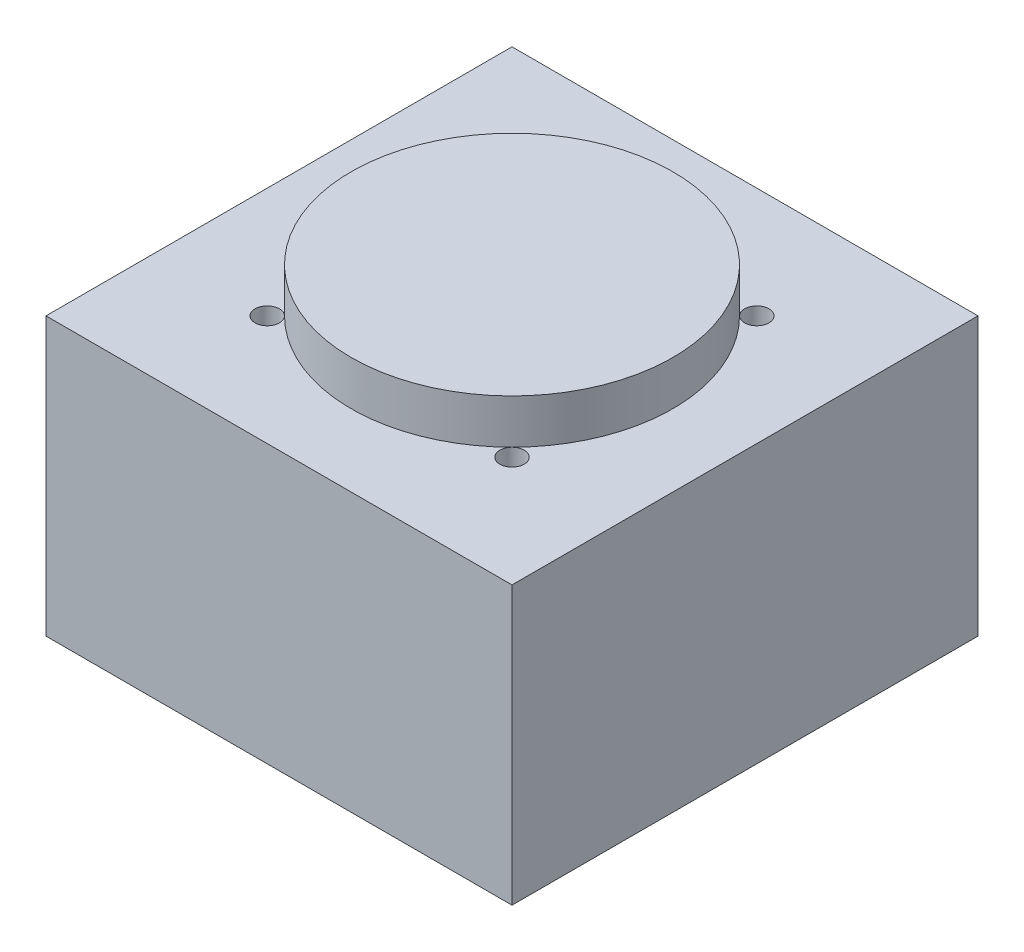
ISO-10303-21;
HEADER;
FILE_DESCRIPTION(('STEP AP214'),'2;1');
FILE_NAME('part.step','',(''),(''),'','','');
FILE_SCHEMA(('AUTOMOTIVE_DESIGN { 1 0 10303 214 1 1 1 1 }'));
ENDSEC;
DATA;
#1=APPLICATION_CONTEXT('core data for automotive mechanical design processes');
#2=APPLICATION_PROTOCOL_DEFINITION('international standard','automotive_design',2000,#1);
#3=PRODUCT_CONTEXT('',#1,'mechanical');
#4=PRODUCT('Part','Part','',(#3));
#5=PRODUCT_RELATED_PRODUCT_CATEGORY('part','',(#4));
#6=PRODUCT_DEFINITION_FORMATION('','',#4);
#7=PRODUCT_DEFINITION_CONTEXT('part definition',#1,'design');
#8=PRODUCT_DEFINITION('design','',#6,#7);
#9=PRODUCT_DEFINITION_SHAPE('','',#8);
#10=(LENGTH_UNIT() NAMED_UNIT(*) SI_UNIT(.MILLI.,.METRE.));
#11=(NAMED_UNIT(*) PLANE_ANGLE_UNIT() SI_UNIT($,.RADIAN.));
#12=(NAMED_UNIT(*) SI_UNIT($,.STERADIAN.) SOLID_ANGLE_UNIT());
#13=UNCERTAINTY_MEASURE_WITH_UNIT(LENGTH_MEASURE(1.E-05),#10,'distance_accuracy_value','');
#14=(GEOMETRIC_REPRESENTATION_CONTEXT(3) GLOBAL_UNCERTAINTY_ASSIGNED_CONTEXT((#13)) GLOBAL_UNIT_ASSIGNED_CONTEXT((#10,
#11,#12)) REPRESENTATION_CONTEXT('',''));
#15=CARTESIAN_POINT('',(0.,0.,0.));
#16=DIRECTION('',(0.,0.,1.));
#17=DIRECTION('',(1.,0.,0.));
#18=AXIS2_PLACEMENT_3D('',#15,#16,#17);
#19=CARTESIAN_POINT('',(0.,125.,0.));
#20=DIRECTION('',(0.,-1.,0.));
#21=DIRECTION('',(0.,0.,-1.));
#22=AXIS2_PLACEMENT_3D('',#19,#20,#21);
#23=PLANE('',#22);
#24=CARTESIAN_POINT('',(0.,125.,0.));
#25=DIRECTION('',(0.,-1.,0.));
#26=DIRECTION('',(0.,0.,-1.));
#27=AXIS2_PLACEMENT_3D('',#24,#25,#26);
#28=CIRCLE('',#27,72.5);
#29=CARTESIAN_POINT('',(-51.2652416360247,125.,-51.2652416360247));
#30=VERTEX_POINT('',#29);
#31=CARTESIAN_POINT('',(-51.2652416360247,125.,51.2652416360247));
#32=VERTEX_POINT('',#31);
#33=EDGE_CURVE('E96',#30,#32,#28,.F.);
#34=ORIENTED_EDGE('',*,*,#33,.F.);
#35=CARTESIAN_POINT('',(-55.1543289325507,125.,-55.1543289325507));
#36=DIRECTION('',(0.,1.,0.));
#37=DIRECTION('',(0.,0.,1.));
#38=AXIS2_PLACEMENT_3D('',#35,#36,#37);
#39=CIRCLE('',#38,5.5);
#40=EDGE_CURVE('E93',#30,#30,#39,.T.);
#41=ORIENTED_EDGE('',*,*,#40,.F.);
#42=CARTESIAN_POINT('',(51.2652416360247,125.,-51.2652416360247));
#43=VERTEX_POINT('',#42);
#44=EDGE_CURVE('E54',#43,#30,#28,.F.);
#45=ORIENTED_EDGE('',*,*,#44,.F.);
#46=CARTESIAN_POINT('',(55.1543289325507,125.,-55.1543289325507));
#47=DIRECTION('',(0.,1.,0.));
#48=DIRECTION('',(0.,0.,1.));
#49=AXIS2_PLACEMENT_3D('',#46,#47,#48);
#50=CIRCLE('',#49,5.50000000000002);
#51=EDGE_CURVE('E102',#43,#43,#50,.T.);
#52=ORIENTED_EDGE('',*,*,#51,.F.);
#53=CARTESIAN_POINT('',(51.2652416360246,125.,51.2652416360246));
#54=VERTEX_POINT('',#53);
#55=EDGE_CURVE('E186',#54,#43,#28,.F.);
#56=ORIENTED_EDGE('',*,*,#55,.F.);
#57=CARTESIAN_POINT('',(55.1543289325507,125.,55.1543289325506));
#58=DIRECTION('',(0.,1.,0.));
#59=DIRECTION('',(0.,0.,1.));
#60=AXIS2_PLACEMENT_3D('',#57,#58,#59);
#61=CIRCLE('',#60,5.50000000000002);
#62=EDGE_CURVE('E197',#54,#54,#61,.T.);
#63=ORIENTED_EDGE('',*,*,#62,.F.);
#64=EDGE_CURVE('E61',#32,#54,#28,.F.);
#65=ORIENTED_EDGE('',*,*,#64,.F.);
#66=CARTESIAN_POINT('',(-55.1543289325507,125.,55.1543289325507));
#67=DIRECTION('',(0.,1.,0.));
#68=DIRECTION('',(0.,0.,1.));
#69=AXIS2_PLACEMENT_3D('',#66,#67,#68);
#70=CIRCLE('',#69,5.5);
#71=EDGE_CURVE('E105',#32,#32,#70,.T.);
#72=ORIENTED_EDGE('',*,*,#71,.F.);
#73=EDGE_LOOP('',(#34,#41,#45,#52,#56,#63,#65,#72));
#74=FACE_BOUND('',#73,.T.);
#75=DIRECTION('',(0.,0.,-1.));
#76=VECTOR('',#75,1.);
#77=CARTESIAN_POINT('',(105.,125.,105.));
#78=LINE('',#77,#76);
#79=CARTESIAN_POINT('',(105.,125.,105.));
#80=VERTEX_POINT('',#79);
#81=CARTESIAN_POINT('',(105.,125.,-105.));
#82=VERTEX_POINT('',#81);
#83=EDGE_CURVE('E113',#80,#82,#78,.T.);
#84=ORIENTED_EDGE('',*,*,#83,.T.);
#85=DIRECTION('',(-1.,0.,0.));
#86=VECTOR('',#85,1.);
#87=CARTESIAN_POINT('',(-105.,125.,-105.));
#88=LINE('',#87,#86);
#89=CARTESIAN_POINT('',(-105.,125.,-105.));
#90=VERTEX_POINT('',#89);
#91=EDGE_CURVE('E116',#82,#90,#88,.T.);
#92=ORIENTED_EDGE('',*,*,#91,.T.);
#93=DIRECTION('',(0.,0.,1.));
#94=VECTOR('',#93,1.);
#95=CARTESIAN_POINT('',(-105.,125.,105.));
#96=LINE('',#95,#94);
#97=CARTESIAN_POINT('',(-105.,125.,105.));
#98=VERTEX_POINT('',#97);
#99=EDGE_CURVE('E119',#90,#98,#96,.T.);
#100=ORIENTED_EDGE('',*,*,#99,.T.);
#101=DIRECTION('',(1.,0.,0.));
#102=VECTOR('',#101,1.);
#103=CARTESIAN_POINT('',(-105.,125.,105.));
#104=LINE('',#103,#102);
#105=EDGE_CURVE('E121',#98,#80,#104,.T.);
#106=ORIENTED_EDGE('',*,*,#105,.T.);
#107=EDGE_LOOP('',(#84,#92,#100,#106));
#108=FACE_BOUND('',#107,.T.);
#109=ADVANCED_FACE('F39',(#74,#108),#23,.F.);
#110=CARTESIAN_POINT('',(0.,0.,0.));
#111=DIRECTION('',(0.,-1.,0.));
#112=DIRECTION('',(0.,0.,-1.));
#113=AXIS2_PLACEMENT_3D('',#110,#111,#112);
#114=PLANE('',#113);
#115=CARTESIAN_POINT('',(-55.1543289325507,0.,55.1543289325507));
#116=DIRECTION('',(0.,1.,0.));
#117=DIRECTION('',(0.,0.,1.));
#118=AXIS2_PLACEMENT_3D('',#115,#116,#117);
#119=CIRCLE('',#118,5.5);
#120=CARTESIAN_POINT('',(-55.1543289325507,0.,60.6543289325507));
#121=VERTEX_POINT('',#120);
#122=EDGE_CURVE('E108',#121,#121,#119,.T.);
#123=ORIENTED_EDGE('',*,*,#122,.T.);
#124=EDGE_LOOP('',(#123));
#125=FACE_BOUND('',#124,.T.);
#126=CARTESIAN_POINT('',(55.1543289325507,0.,55.1543289325506));
#127=DIRECTION('',(0.,1.,0.));
#128=DIRECTION('',(0.,0.,1.));
#129=AXIS2_PLACEMENT_3D('',#126,#127,#128);
#130=CIRCLE('',#129,5.50000000000002);
#131=CARTESIAN_POINT('',(55.1543289325507,0.,60.6543289325507));
#132=VERTEX_POINT('',#131);
#133=EDGE_CURVE('E195',#132,#132,#130,.T.);
#134=ORIENTED_EDGE('',*,*,#133,.T.);
#135=EDGE_LOOP('',(#134));
#136=FACE_BOUND('',#135,.T.);
#137=CARTESIAN_POINT('',(55.1543289325507,0.,-55.1543289325507));
#138=DIRECTION('',(0.,1.,0.));
#139=DIRECTION('',(0.,0.,1.));
#140=AXIS2_PLACEMENT_3D('',#137,#138,#139);
#141=CIRCLE('',#140,5.50000000000002);
#142=CARTESIAN_POINT('',(55.1543289325507,0.,-49.6543289325507));
#143=VERTEX_POINT('',#142);
#144=EDGE_CURVE('E98',#143,#143,#141,.T.);
#145=ORIENTED_EDGE('',*,*,#144,.T.);
#146=EDGE_LOOP('',(#145));
#147=FACE_BOUND('',#146,.T.);
#148=CARTESIAN_POINT('',(-55.1543289325507,0.,-55.1543289325507));
#149=DIRECTION('',(0.,1.,0.));
#150=DIRECTION('',(0.,0.,1.));
#151=AXIS2_PLACEMENT_3D('',#148,#149,#150);
#152=CIRCLE('',#151,5.5);
#153=CARTESIAN_POINT('',(-55.1543289325507,0.,-49.6543289325507));
#154=VERTEX_POINT('',#153);
#155=EDGE_CURVE('E99',#154,#154,#152,.T.);
#156=ORIENTED_EDGE('',*,*,#155,.T.);
#157=EDGE_LOOP('',(#156));
#158=FACE_BOUND('',#157,.T.);
#159=DIRECTION('',(0.,0.,-1.));
#160=VECTOR('',#159,1.);
#161=CARTESIAN_POINT('',(105.,0.,105.));
#162=LINE('',#161,#160);
#163=CARTESIAN_POINT('',(105.,0.,105.));
#164=VERTEX_POINT('',#163);
#165=CARTESIAN_POINT('',(105.,0.,-105.));
#166=VERTEX_POINT('',#165);
#167=EDGE_CURVE('E111',#164,#166,#162,.T.);
#168=ORIENTED_EDGE('',*,*,#167,.F.);
#169=DIRECTION('',(1.,0.,0.));
#170=VECTOR('',#169,1.);
#171=CARTESIAN_POINT('',(-105.,0.,105.));
#172=LINE('',#171,#170);
#173=CARTESIAN_POINT('',(-105.,0.,105.));
#174=VERTEX_POINT('',#173);
#175=EDGE_CURVE('E117',#174,#164,#172,.T.);
#176=ORIENTED_EDGE('',*,*,#175,.F.);
#177=DIRECTION('',(0.,0.,1.));
#178=VECTOR('',#177,1.);
#179=CARTESIAN_POINT('',(-105.,0.,105.));
#180=LINE('',#179,#178);
#181=CARTESIAN_POINT('',(-105.,0.,-105.));
#182=VERTEX_POINT('',#181);
#183=EDGE_CURVE('E128',#182,#174,#180,.T.);
#184=ORIENTED_EDGE('',*,*,#183,.F.);
#185=DIRECTION('',(-1.,0.,0.));
#186=VECTOR('',#185,1.);
#187=CARTESIAN_POINT('',(-105.,0.,-105.));
#188=LINE('',#187,#186);
#189=EDGE_CURVE('E126',#166,#182,#188,.T.);
#190=ORIENTED_EDGE('',*,*,#189,.F.);
#191=EDGE_LOOP('',(#168,#176,#184,#190));
#192=FACE_BOUND('',#191,.T.);
#193=ADVANCED_FACE('F146',(#125,#136,#147,#158,#192),#114,.T.);
#194=CARTESIAN_POINT('',(105.,125.,105.));
#195=DIRECTION('',(-1.,0.,0.));
#196=DIRECTION('',(0.,0.,1.));
#197=AXIS2_PLACEMENT_3D('',#194,#195,#196);
#198=PLANE('',#197);
#199=ORIENTED_EDGE('',*,*,#167,.T.);
#200=DIRECTION('',(0.,-1.,0.));
#201=VECTOR('',#200,1.);
#202=CARTESIAN_POINT('',(105.,125.,-105.));
#203=LINE('',#202,#201);
#204=EDGE_CURVE('E11',#82,#166,#203,.T.);
#205=ORIENTED_EDGE('',*,*,#204,.F.);
#206=ORIENTED_EDGE('',*,*,#83,.F.);
#207=DIRECTION('',(0.,-1.,0.));
#208=VECTOR('',#207,1.);
#209=CARTESIAN_POINT('',(105.,125.,105.));
#210=LINE('',#209,#208);
#211=EDGE_CURVE('E123',#80,#164,#210,.T.);
#212=ORIENTED_EDGE('',*,*,#211,.T.);
#213=EDGE_LOOP('',(#199,#205,#206,#212));
#214=FACE_BOUND('',#213,.T.);
#215=ADVANCED_FACE('F41',(#214),#198,.F.);
#216=CARTESIAN_POINT('',(-105.,125.,-105.));
#217=DIRECTION('',(0.,0.,1.));
#218=DIRECTION('',(1.,0.,0.));
#219=AXIS2_PLACEMENT_3D('',#216,#217,#218);
#220=PLANE('',#219);
#221=ORIENTED_EDGE('',*,*,#189,.T.);
#222=DIRECTION('',(0.,-1.,0.));
#223=VECTOR('',#222,1.);
#224=CARTESIAN_POINT('',(-105.,125.,-105.));
#225=LINE('',#224,#223);
#226=EDGE_CURVE('E47',#90,#182,#225,.T.);
#227=ORIENTED_EDGE('',*,*,#226,.F.);
#228=ORIENTED_EDGE('',*,*,#91,.F.);
#229=ORIENTED_EDGE('',*,*,#204,.T.);
#230=EDGE_LOOP('',(#221,#227,#228,#229));
#231=FACE_BOUND('',#230,.T.);
#232=ADVANCED_FACE('F154',(#231),#220,.F.);
#233=CARTESIAN_POINT('',(-105.,125.,105.));
#234=DIRECTION('',(1.,0.,0.));
#235=DIRECTION('',(0.,0.,-1.));
#236=AXIS2_PLACEMENT_3D('',#233,#234,#235);
#237=PLANE('',#236);
#238=ORIENTED_EDGE('',*,*,#183,.T.);
#239=DIRECTION('',(0.,-1.,0.));
#240=VECTOR('',#239,1.);
#241=CARTESIAN_POINT('',(-105.,125.,105.));
#242=LINE('',#241,#240);
#243=EDGE_CURVE('E133',#98,#174,#242,.T.);
#244=ORIENTED_EDGE('',*,*,#243,.F.);
#245=ORIENTED_EDGE('',*,*,#99,.F.);
#246=ORIENTED_EDGE('',*,*,#226,.T.);
#247=EDGE_LOOP('',(#238,#244,#245,#246));
#248=FACE_BOUND('',#247,.T.);
#249=ADVANCED_FACE('F140',(#248),#237,.F.);
#250=CARTESIAN_POINT('',(-105.,125.,105.));
#251=DIRECTION('',(0.,0.,-1.));
#252=DIRECTION('',(-1.,0.,0.));
#253=AXIS2_PLACEMENT_3D('',#250,#251,#252);
#254=PLANE('',#253);
#255=ORIENTED_EDGE('',*,*,#175,.T.);
#256=ORIENTED_EDGE('',*,*,#211,.F.);
#257=ORIENTED_EDGE('',*,*,#105,.F.);
#258=ORIENTED_EDGE('',*,*,#243,.T.);
#259=EDGE_LOOP('',(#255,#256,#257,#258));
#260=FACE_BOUND('',#259,.T.);
#261=ADVANCED_FACE('F149',(#260),#254,.F.);
#262=CARTESIAN_POINT('',(55.1543289325507,125.,-55.1543289325507));
#263=DIRECTION('',(0.,-1.,0.));
#264=DIRECTION('',(0.,0.,-1.));
#265=AXIS2_PLACEMENT_3D('',#262,#263,#264);
#266=CYLINDRICAL_SURFACE('',#265,5.50000000000002);
#267=ORIENTED_EDGE('',*,*,#144,.F.);
#268=EDGE_LOOP('',(#267));
#269=FACE_BOUND('',#268,.T.);
#270=ORIENTED_EDGE('',*,*,#51,.T.);
#271=EDGE_LOOP('',(#270));
#272=FACE_BOUND('',#271,.T.);
#273=ADVANCED_FACE('F169',(#269,#272),#266,.F.);
#274=CARTESIAN_POINT('',(-55.1543289325507,125.,-55.1543289325507));
#275=DIRECTION('',(0.,-1.,0.));
#276=DIRECTION('',(0.,0.,-1.));
#277=AXIS2_PLACEMENT_3D('',#274,#275,#276);
#278=CYLINDRICAL_SURFACE('',#277,5.5);
#279=ORIENTED_EDGE('',*,*,#155,.F.);
#280=EDGE_LOOP('',(#279));
#281=FACE_BOUND('',#280,.T.);
#282=ORIENTED_EDGE('',*,*,#40,.T.);
#283=EDGE_LOOP('',(#282));
#284=FACE_BOUND('',#283,.T.);
#285=ADVANCED_FACE('F176',(#281,#284),#278,.F.);
#286=CARTESIAN_POINT('',(-55.1543289325507,125.,55.1543289325507));
#287=DIRECTION('',(0.,-1.,0.));
#288=DIRECTION('',(0.,0.,-1.));
#289=AXIS2_PLACEMENT_3D('',#286,#287,#288);
#290=CYLINDRICAL_SURFACE('',#289,5.5);
#291=ORIENTED_EDGE('',*,*,#122,.F.);
#292=EDGE_LOOP('',(#291));
#293=FACE_BOUND('',#292,.T.);
#294=ORIENTED_EDGE('',*,*,#71,.T.);
#295=EDGE_LOOP('',(#294));
#296=FACE_BOUND('',#295,.T.);
#297=ADVANCED_FACE('F181',(#293,#296),#290,.F.);
#298=CARTESIAN_POINT('',(55.1543289325507,125.,55.1543289325506));
#299=DIRECTION('',(0.,-1.,0.));
#300=DIRECTION('',(0.,0.,-1.));
#301=AXIS2_PLACEMENT_3D('',#298,#299,#300);
#302=CYLINDRICAL_SURFACE('',#301,5.50000000000002);
#303=ORIENTED_EDGE('',*,*,#133,.F.);
#304=EDGE_LOOP('',(#303));
#305=FACE_BOUND('',#304,.T.);
#306=ORIENTED_EDGE('',*,*,#62,.T.);
#307=EDGE_LOOP('',(#306));
#308=FACE_BOUND('',#307,.T.);
#309=ADVANCED_FACE('F206',(#305,#308),#302,.F.);
#310=CARTESIAN_POINT('',(0.,145.,0.));
#311=DIRECTION('',(0.,-1.,0.));
#312=DIRECTION('',(0.,0.,-1.));
#313=AXIS2_PLACEMENT_3D('',#310,#311,#312);
#314=CYLINDRICAL_SURFACE('',#313,72.5);
#315=CARTESIAN_POINT('',(0.,145.,0.));
#316=DIRECTION('',(0.,1.,0.));
#317=DIRECTION('',(0.,0.,1.));
#318=AXIS2_PLACEMENT_3D('',#315,#316,#317);
#319=CIRCLE('',#318,72.5);
#320=CARTESIAN_POINT('',(0.,145.,72.5));
#321=VERTEX_POINT('',#320);
#322=EDGE_CURVE('E190',#321,#321,#319,.T.);
#323=ORIENTED_EDGE('',*,*,#322,.F.);
#324=EDGE_LOOP('',(#323));
#325=FACE_BOUND('',#324,.T.);
#326=ORIENTED_EDGE('',*,*,#44,.T.);
#327=ORIENTED_EDGE('',*,*,#33,.T.);
#328=ORIENTED_EDGE('',*,*,#64,.T.);
#329=ORIENTED_EDGE('',*,*,#55,.T.);
#330=EDGE_LOOP('',(#326,#327,#328,#329));
#331=FACE_BOUND('',#330,.T.);
#332=ADVANCED_FACE('F189',(#325,#331),#314,.T.);
#333=CARTESIAN_POINT('',(0.,145.,0.));
#334=DIRECTION('',(0.,1.,0.));
#335=DIRECTION('',(0.,0.,1.));
#336=AXIS2_PLACEMENT_3D('',#333,#334,#335);
#337=PLANE('',#336);
#338=ORIENTED_EDGE('',*,*,#322,.T.);
#339=EDGE_LOOP('',(#338));
#340=FACE_BOUND('',#339,.T.);
#341=ADVANCED_FACE('F216',(#340),#337,.T.);
#342=CLOSED_SHELL('',(#109,#193,#215,#232,#249,#261,#273,#285,#297,#309,#332,#341));
#343=MANIFOLD_SOLID_BREP('B2',#342);
#344=ADVANCED_BREP_SHAPE_REPRESENTATION('',(#18,#343),#14);
#345=SHAPE_DEFINITION_REPRESENTATION(#9,#344);
ENDSEC;
END-ISO-10303-21;
